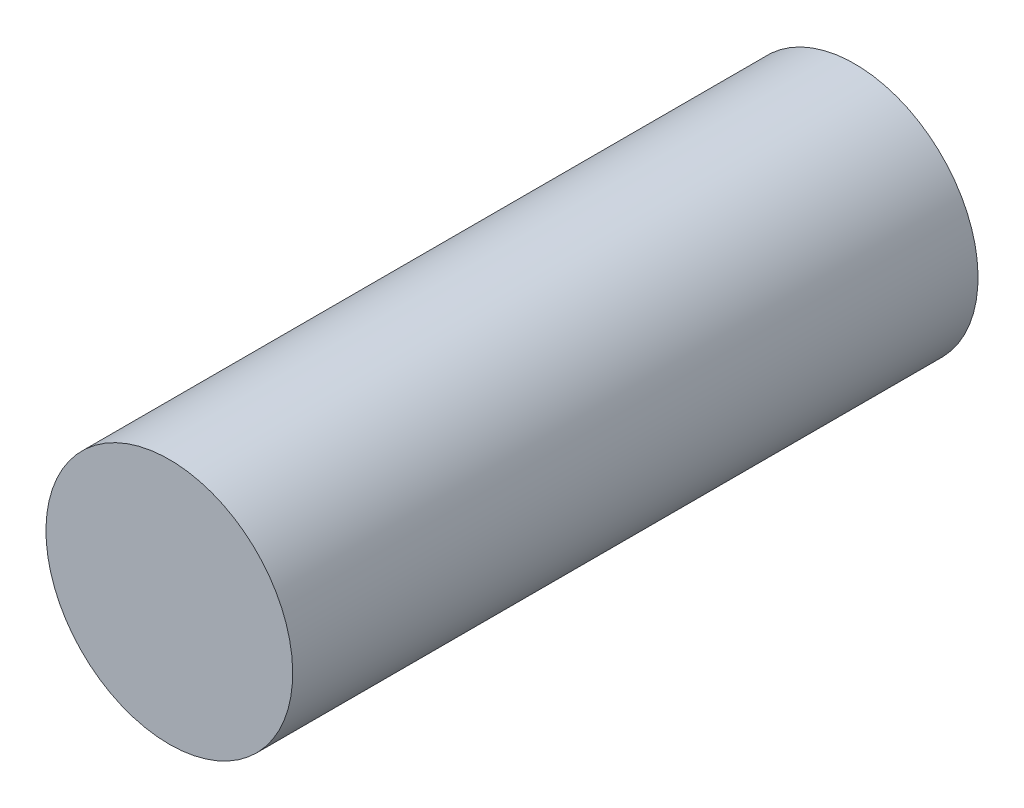
ISO-10303-21;
HEADER;
FILE_DESCRIPTION(('STEP AP214'),'2;1');
FILE_NAME('part.step','',(''),(''),'','','');
FILE_SCHEMA(('AUTOMOTIVE_DESIGN { 1 0 10303 214 1 1 1 1 }'));
ENDSEC;
DATA;
#1=APPLICATION_CONTEXT('core data for automotive mechanical design processes');
#2=APPLICATION_PROTOCOL_DEFINITION('international standard','automotive_design',2000,#1);
#3=PRODUCT_CONTEXT('',#1,'mechanical');
#4=PRODUCT('Part','Part','',(#3));
#5=PRODUCT_RELATED_PRODUCT_CATEGORY('part','',(#4));
#6=PRODUCT_DEFINITION_FORMATION('','',#4);
#7=PRODUCT_DEFINITION_CONTEXT('part definition',#1,'design');
#8=PRODUCT_DEFINITION('design','',#6,#7);
#9=PRODUCT_DEFINITION_SHAPE('','',#8);
#10=(LENGTH_UNIT() NAMED_UNIT(*) SI_UNIT(.MILLI.,.METRE.));
#11=(NAMED_UNIT(*) PLANE_ANGLE_UNIT() SI_UNIT($,.RADIAN.));
#12=(NAMED_UNIT(*) SI_UNIT($,.STERADIAN.) SOLID_ANGLE_UNIT());
#13=UNCERTAINTY_MEASURE_WITH_UNIT(LENGTH_MEASURE(1.E-05),#10,'distance_accuracy_value','');
#14=(GEOMETRIC_REPRESENTATION_CONTEXT(3) GLOBAL_UNCERTAINTY_ASSIGNED_CONTEXT((#13)) GLOBAL_UNIT_ASSIGNED_CONTEXT((#10,
#11,#12)) REPRESENTATION_CONTEXT('',''));
#15=CARTESIAN_POINT('',(0.,0.,0.));
#16=DIRECTION('',(0.,0.,1.));
#17=DIRECTION('',(1.,0.,0.));
#18=AXIS2_PLACEMENT_3D('',#15,#16,#17);
#19=CARTESIAN_POINT('',(1.8013,1.8013,10.0013));
#20=DIRECTION('',(0.,0.,1.));
#21=DIRECTION('',(0.,-1.,0.));
#22=AXIS2_PLACEMENT_3D('',#19,#20,#21);
#23=PLANE('',#22);
#24=CARTESIAN_POINT('',(1.8013,1.8013,10.0013));
#25=DIRECTION('',(0.,0.,1.));
#26=DIRECTION('',(0.,-1.,0.));
#27=AXIS2_PLACEMENT_3D('',#24,#25,#26);
#28=CIRCLE('',#27,1.8);
#29=CARTESIAN_POINT('',(1.8013,0.00130000000000095,10.0013));
#30=VERTEX_POINT('',#29);
#31=EDGE_CURVE('E16',#30,#30,#28,.F.);
#32=ORIENTED_EDGE('',*,*,#31,.F.);
#33=EDGE_LOOP('',(#32));
#34=FACE_BOUND('',#33,.T.);
#35=ADVANCED_FACE('F13',(#34),#23,.T.);
#36=CARTESIAN_POINT('',(1.8013,1.8013,0.001299999999901));
#37=DIRECTION('',(0.,0.,1.));
#38=DIRECTION('',(0.,-1.,0.));
#39=AXIS2_PLACEMENT_3D('',#36,#37,#38);
#40=PLANE('',#39);
#41=CARTESIAN_POINT('',(1.8013,1.8013,0.0012999999999008));
#42=DIRECTION('',(0.,0.,1.));
#43=DIRECTION('',(0.,-1.,0.));
#44=AXIS2_PLACEMENT_3D('',#41,#42,#43);
#45=CIRCLE('',#44,1.8);
#46=CARTESIAN_POINT('',(1.8013,0.00129999999999987,0.001299999999901));
#47=VERTEX_POINT('',#46);
#48=EDGE_CURVE('E8',#47,#47,#45,.T.);
#49=ORIENTED_EDGE('',*,*,#48,.F.);
#50=EDGE_LOOP('',(#49));
#51=FACE_BOUND('',#50,.T.);
#52=ADVANCED_FACE('F28',(#51),#40,.F.);
#53=CARTESIAN_POINT('',(1.8013,1.8013,0.001299999999901));
#54=DIRECTION('',(0.,0.,1.));
#55=DIRECTION('',(0.,-1.,0.));
#56=AXIS2_PLACEMENT_3D('',#53,#54,#55);
#57=CYLINDRICAL_SURFACE('',#56,1.8);
#58=ORIENTED_EDGE('',*,*,#48,.T.);
#59=EDGE_LOOP('',(#58));
#60=FACE_BOUND('',#59,.T.);
#61=ORIENTED_EDGE('',*,*,#31,.T.);
#62=EDGE_LOOP('',(#61));
#63=FACE_BOUND('',#62,.T.);
#64=ADVANCED_FACE('F25',(#60,#63),#57,.T.);
#65=CLOSED_SHELL('',(#35,#52,#64));
#66=MANIFOLD_SOLID_BREP('B1',#65);
#67=ADVANCED_BREP_SHAPE_REPRESENTATION('',(#18,#66),#14);
#68=SHAPE_DEFINITION_REPRESENTATION(#9,#67);
ENDSEC;
END-ISO-10303-21;
